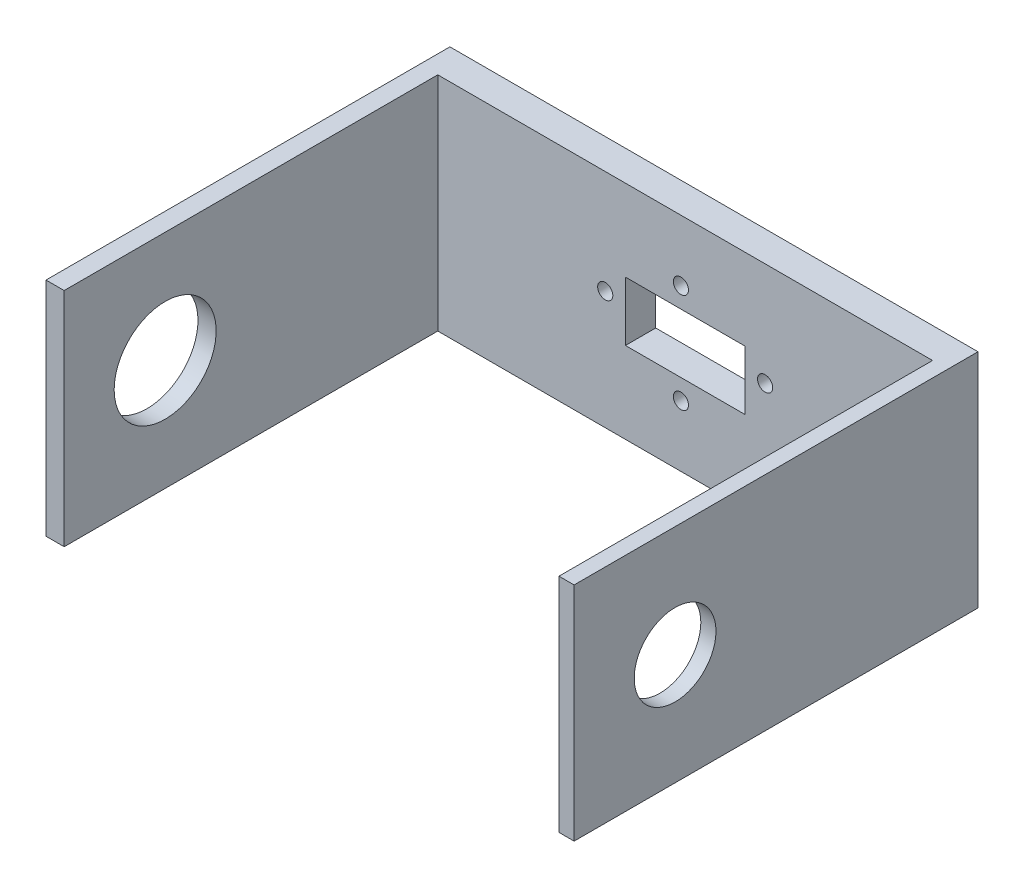
ISO-10303-21;
HEADER;
FILE_DESCRIPTION(('STEP AP214'),'2;1');
FILE_NAME('part.step','',(''),(''),'','','');
FILE_SCHEMA(('AUTOMOTIVE_DESIGN { 1 0 10303 214 1 1 1 1 }'));
ENDSEC;
DATA;
#1=APPLICATION_CONTEXT('core data for automotive mechanical design processes');
#2=APPLICATION_PROTOCOL_DEFINITION('international standard','automotive_design',2000,#1);
#3=PRODUCT_CONTEXT('',#1,'mechanical');
#4=PRODUCT('Part','Part','',(#3));
#5=PRODUCT_RELATED_PRODUCT_CATEGORY('part','',(#4));
#6=PRODUCT_DEFINITION_FORMATION('','',#4);
#7=PRODUCT_DEFINITION_CONTEXT('part definition',#1,'design');
#8=PRODUCT_DEFINITION('design','',#6,#7);
#9=PRODUCT_DEFINITION_SHAPE('','',#8);
#10=(LENGTH_UNIT() NAMED_UNIT(*) SI_UNIT(.MILLI.,.METRE.));
#11=(NAMED_UNIT(*) PLANE_ANGLE_UNIT() SI_UNIT($,.RADIAN.));
#12=(NAMED_UNIT(*) SI_UNIT($,.STERADIAN.) SOLID_ANGLE_UNIT());
#13=UNCERTAINTY_MEASURE_WITH_UNIT(LENGTH_MEASURE(1.E-05),#10,'distance_accuracy_value','');
#14=(GEOMETRIC_REPRESENTATION_CONTEXT(3) GLOBAL_UNCERTAINTY_ASSIGNED_CONTEXT((#13)) GLOBAL_UNIT_ASSIGNED_CONTEXT((#10,
#11,#12)) REPRESENTATION_CONTEXT('',''));
#15=CARTESIAN_POINT('',(0.,0.,0.));
#16=DIRECTION('',(0.,0.,1.));
#17=DIRECTION('',(1.,0.,0.));
#18=AXIS2_PLACEMENT_3D('',#15,#16,#17);
#19=CARTESIAN_POINT('',(0.,0.,3.));
#20=DIRECTION('',(0.,0.,-1.));
#21=DIRECTION('',(-1.,0.,0.));
#22=AXIS2_PLACEMENT_3D('',#19,#20,#21);
#23=PLANE('',#22);
#24=DIRECTION('',(0.,1.,0.));
#25=VECTOR('',#24,1.);
#26=CARTESIAN_POINT('',(24.5,-10.9882336679256,3.));
#27=LINE('',#26,#25);
#28=CARTESIAN_POINT('',(24.5,-10.9882336720744,3.));
#29=VERTEX_POINT('',#28);
#30=CARTESIAN_POINT('',(24.5,10.9882336679256,3.));
#31=VERTEX_POINT('',#30);
#32=EDGE_CURVE('E276',#29,#31,#27,.T.);
#33=ORIENTED_EDGE('',*,*,#32,.T.);
#34=DIRECTION('',(-1.,0.,0.));
#35=VECTOR('',#34,1.);
#36=CARTESIAN_POINT('',(-24.5,10.9882336679256,3.));
#37=LINE('',#36,#35);
#38=CARTESIAN_POINT('',(-24.5,10.9882336679256,3.));
#39=VERTEX_POINT('',#38);
#40=EDGE_CURVE('E280',#31,#39,#37,.T.);
#41=ORIENTED_EDGE('',*,*,#40,.T.);
#42=DIRECTION('',(0.,-1.,0.));
#43=VECTOR('',#42,1.);
#44=CARTESIAN_POINT('',(-24.5,-10.9882336679256,3.));
#45=LINE('',#44,#43);
#46=CARTESIAN_POINT('',(-24.5,-10.9882336679256,3.));
#47=VERTEX_POINT('',#46);
#48=EDGE_CURVE('E49',#39,#47,#45,.T.);
#49=ORIENTED_EDGE('',*,*,#48,.T.);
#50=DIRECTION('',(1.,0.,0.));
#51=VECTOR('',#50,1.);
#52=CARTESIAN_POINT('',(-24.5,-10.9882336679256,3.));
#53=LINE('',#52,#51);
#54=EDGE_CURVE('E11',#47,#29,#53,.T.);
#55=ORIENTED_EDGE('',*,*,#54,.T.);
#56=EDGE_LOOP('',(#33,#41,#49,#55));
#57=FACE_BOUND('',#56,.T.);
#58=DIRECTION('',(0.,1.,0.));
#59=VECTOR('',#58,1.);
#60=CARTESIAN_POINT('',(5.91604588219118,-2.93281751688852,3.));
#61=LINE('',#60,#59);
#62=CARTESIAN_POINT('',(5.91604588219118,-2.93281751688852,3.));
#63=VERTEX_POINT('',#62);
#64=CARTESIAN_POINT('',(5.91604588219118,2.93281751688852,3.));
#65=VERTEX_POINT('',#64);
#66=EDGE_CURVE('E238',#63,#65,#61,.T.);
#67=ORIENTED_EDGE('',*,*,#66,.F.);
#68=DIRECTION('',(1.,0.,0.));
#69=VECTOR('',#68,1.);
#70=CARTESIAN_POINT('',(-5.91604588219121,-2.93281751688852,3.));
#71=LINE('',#70,#69);
#72=CARTESIAN_POINT('',(-5.91604588219121,-2.93281751688852,3.));
#73=VERTEX_POINT('',#72);
#74=EDGE_CURVE('E248',#73,#63,#71,.T.);
#75=ORIENTED_EDGE('',*,*,#74,.F.);
#76=DIRECTION('',(0.,-1.,0.));
#77=VECTOR('',#76,1.);
#78=CARTESIAN_POINT('',(-5.91604588219121,-2.93281751688852,3.));
#79=LINE('',#78,#77);
#80=CARTESIAN_POINT('',(-5.91604588219121,2.93281751688851,3.));
#81=VERTEX_POINT('',#80);
#82=EDGE_CURVE('E245',#81,#73,#79,.T.);
#83=ORIENTED_EDGE('',*,*,#82,.F.);
#84=DIRECTION('',(-1.,0.,0.));
#85=VECTOR('',#84,1.);
#86=CARTESIAN_POINT('',(-5.91604588219121,2.93281751688851,3.));
#87=LINE('',#86,#85);
#88=EDGE_CURVE('E241',#65,#81,#87,.T.);
#89=ORIENTED_EDGE('',*,*,#88,.F.);
#90=EDGE_LOOP('',(#67,#75,#83,#89));
#91=FACE_BOUND('',#90,.T.);
#92=CARTESIAN_POINT('',(-0.421929048228402,4.93281751688851,3.));
#93=DIRECTION('',(0.,0.,1.));
#94=DIRECTION('',(1.,0.,0.));
#95=AXIS2_PLACEMENT_3D('',#92,#93,#94);
#96=CIRCLE('',#95,0.750862633974916);
#97=CARTESIAN_POINT('',(0.328933585746514,4.93281751688851,3.));
#98=VERTEX_POINT('',#97);
#99=EDGE_CURVE('E231',#98,#98,#96,.T.);
#100=ORIENTED_EDGE('',*,*,#99,.F.);
#101=EDGE_LOOP('',(#100));
#102=FACE_BOUND('',#101,.T.);
#103=CARTESIAN_POINT('',(7.91604588219118,0.729927039086684,3.));
#104=DIRECTION('',(0.,0.,1.));
#105=DIRECTION('',(1.,0.,0.));
#106=AXIS2_PLACEMENT_3D('',#103,#104,#105);
#107=CIRCLE('',#106,0.750862633974916);
#108=CARTESIAN_POINT('',(8.6669085161661,0.729927039086684,3.));
#109=VERTEX_POINT('',#108);
#110=EDGE_CURVE('E223',#109,#109,#107,.T.);
#111=ORIENTED_EDGE('',*,*,#110,.F.);
#112=EDGE_LOOP('',(#111));
#113=FACE_BOUND('',#112,.T.);
#114=CARTESIAN_POINT('',(-0.421929048228401,-4.93281751688852,3.));
#115=DIRECTION('',(0.,0.,1.));
#116=DIRECTION('',(-1.,0.,0.));
#117=AXIS2_PLACEMENT_3D('',#114,#115,#116);
#118=CIRCLE('',#117,0.750862633974916);
#119=CARTESIAN_POINT('',(-1.17279168220332,-4.93281751688852,3.));
#120=VERTEX_POINT('',#119);
#121=EDGE_CURVE('E215',#120,#120,#118,.T.);
#122=ORIENTED_EDGE('',*,*,#121,.F.);
#123=EDGE_LOOP('',(#122));
#124=FACE_BOUND('',#123,.T.);
#125=CARTESIAN_POINT('',(-7.91604588219121,0.729927039086682,3.));
#126=DIRECTION('',(0.,0.,1.));
#127=DIRECTION('',(-1.,0.,0.));
#128=AXIS2_PLACEMENT_3D('',#125,#126,#127);
#129=CIRCLE('',#128,0.750862633974916);
#130=CARTESIAN_POINT('',(-8.66690851616612,0.729927039086682,3.));
#131=VERTEX_POINT('',#130);
#132=EDGE_CURVE('E207',#131,#131,#129,.T.);
#133=ORIENTED_EDGE('',*,*,#132,.F.);
#134=EDGE_LOOP('',(#133));
#135=FACE_BOUND('',#134,.T.);
#136=ADVANCED_FACE('F39',(#57,#91,#102,#113,#124,#135),#23,.F.);
#137=CARTESIAN_POINT('',(0.,0.,0.));
#138=DIRECTION('',(0.,0.,-1.));
#139=DIRECTION('',(-1.,0.,0.));
#140=AXIS2_PLACEMENT_3D('',#137,#138,#139);
#141=PLANE('',#140);
#142=CARTESIAN_POINT('',(-0.421929048228401,-4.93281751688852,0.));
#143=DIRECTION('',(0.,0.,1.));
#144=DIRECTION('',(-1.,0.,0.));
#145=AXIS2_PLACEMENT_3D('',#142,#143,#144);
#146=CIRCLE('',#145,0.750862633974916);
#147=CARTESIAN_POINT('',(-1.17279168220332,-4.93281751688852,0.));
#148=VERTEX_POINT('',#147);
#149=EDGE_CURVE('E211',#148,#148,#146,.T.);
#150=ORIENTED_EDGE('',*,*,#149,.T.);
#151=EDGE_LOOP('',(#150));
#152=FACE_BOUND('',#151,.T.);
#153=CARTESIAN_POINT('',(-0.421929048228402,4.93281751688851,0.));
#154=DIRECTION('',(0.,0.,1.));
#155=DIRECTION('',(1.,0.,0.));
#156=AXIS2_PLACEMENT_3D('',#153,#154,#155);
#157=CIRCLE('',#156,0.750862633974916);
#158=CARTESIAN_POINT('',(0.328933585746514,4.93281751688851,0.));
#159=VERTEX_POINT('',#158);
#160=EDGE_CURVE('E227',#159,#159,#157,.T.);
#161=ORIENTED_EDGE('',*,*,#160,.T.);
#162=EDGE_LOOP('',(#161));
#163=FACE_BOUND('',#162,.T.);
#164=DIRECTION('',(-1.,0.,0.));
#165=VECTOR('',#164,1.);
#166=CARTESIAN_POINT('',(-24.5,10.9882336679256,0.));
#167=LINE('',#166,#165);
#168=CARTESIAN_POINT('',(26.,10.9882336679256,0.));
#169=VERTEX_POINT('',#168);
#170=CARTESIAN_POINT('',(-26.3,10.9882336679256,0.));
#171=VERTEX_POINT('',#170);
#172=EDGE_CURVE('E275',#169,#171,#167,.T.);
#173=ORIENTED_EDGE('',*,*,#172,.F.);
#174=DIRECTION('',(0.,1.,0.));
#175=VECTOR('',#174,1.);
#176=CARTESIAN_POINT('',(26.,10.9882336679256,0.));
#177=LINE('',#176,#175);
#178=CARTESIAN_POINT('',(26.,-10.9882336720744,0.));
#179=VERTEX_POINT('',#178);
#180=EDGE_CURVE('E152',#179,#169,#177,.T.);
#181=ORIENTED_EDGE('',*,*,#180,.F.);
#182=DIRECTION('',(1.,0.,0.));
#183=VECTOR('',#182,1.);
#184=CARTESIAN_POINT('',(-24.5,-10.9882336679256,0.));
#185=LINE('',#184,#183);
#186=CARTESIAN_POINT('',(-26.3,-10.9882336679256,0.));
#187=VERTEX_POINT('',#186);
#188=EDGE_CURVE('E43',#187,#179,#185,.T.);
#189=ORIENTED_EDGE('',*,*,#188,.F.);
#190=DIRECTION('',(0.,-1.,0.));
#191=VECTOR('',#190,1.);
#192=CARTESIAN_POINT('',(-26.3,10.9882336679256,0.));
#193=LINE('',#192,#191);
#194=EDGE_CURVE('E179',#171,#187,#193,.T.);
#195=ORIENTED_EDGE('',*,*,#194,.F.);
#196=EDGE_LOOP('',(#173,#181,#189,#195));
#197=FACE_BOUND('',#196,.T.);
#198=DIRECTION('',(1.,0.,0.));
#199=VECTOR('',#198,1.);
#200=CARTESIAN_POINT('',(-5.91604588219121,-2.93281751688852,0.));
#201=LINE('',#200,#199);
#202=CARTESIAN_POINT('',(-5.91604588219121,-2.93281751688852,0.));
#203=VERTEX_POINT('',#202);
#204=CARTESIAN_POINT('',(5.91604588219118,-2.93281751688852,0.));
#205=VERTEX_POINT('',#204);
#206=EDGE_CURVE('E242',#203,#205,#201,.T.);
#207=ORIENTED_EDGE('',*,*,#206,.T.);
#208=DIRECTION('',(0.,1.,0.));
#209=VECTOR('',#208,1.);
#210=CARTESIAN_POINT('',(5.91604588219118,-2.93281751688852,0.));
#211=LINE('',#210,#209);
#212=CARTESIAN_POINT('',(5.91604588219118,2.93281751688852,0.));
#213=VERTEX_POINT('',#212);
#214=EDGE_CURVE('E65',#205,#213,#211,.T.);
#215=ORIENTED_EDGE('',*,*,#214,.T.);
#216=DIRECTION('',(-1.,0.,0.));
#217=VECTOR('',#216,1.);
#218=CARTESIAN_POINT('',(-5.91604588219121,2.93281751688851,0.));
#219=LINE('',#218,#217);
#220=CARTESIAN_POINT('',(-5.91604588219121,2.93281751688851,0.));
#221=VERTEX_POINT('',#220);
#222=EDGE_CURVE('E254',#213,#221,#219,.T.);
#223=ORIENTED_EDGE('',*,*,#222,.T.);
#224=DIRECTION('',(0.,-1.,0.));
#225=VECTOR('',#224,1.);
#226=CARTESIAN_POINT('',(-5.91604588219121,-2.93281751688852,0.));
#227=LINE('',#226,#225);
#228=EDGE_CURVE('E258',#221,#203,#227,.T.);
#229=ORIENTED_EDGE('',*,*,#228,.T.);
#230=EDGE_LOOP('',(#207,#215,#223,#229));
#231=FACE_BOUND('',#230,.T.);
#232=CARTESIAN_POINT('',(7.91604588219118,0.729927039086684,0.));
#233=DIRECTION('',(0.,0.,1.));
#234=DIRECTION('',(1.,0.,0.));
#235=AXIS2_PLACEMENT_3D('',#232,#233,#234);
#236=CIRCLE('',#235,0.750862633974916);
#237=CARTESIAN_POINT('',(8.6669085161661,0.729927039086684,0.));
#238=VERTEX_POINT('',#237);
#239=EDGE_CURVE('E219',#238,#238,#236,.T.);
#240=ORIENTED_EDGE('',*,*,#239,.T.);
#241=EDGE_LOOP('',(#240));
#242=FACE_BOUND('',#241,.T.);
#243=CARTESIAN_POINT('',(-7.91604588219121,0.729927039086682,0.));
#244=DIRECTION('',(0.,0.,1.));
#245=DIRECTION('',(-1.,0.,0.));
#246=AXIS2_PLACEMENT_3D('',#243,#244,#245);
#247=CIRCLE('',#246,0.750862633974916);
#248=CARTESIAN_POINT('',(-8.66690851616612,0.729927039086682,0.));
#249=VERTEX_POINT('',#248);
#250=EDGE_CURVE('E206',#249,#249,#247,.T.);
#251=ORIENTED_EDGE('',*,*,#250,.T.);
#252=EDGE_LOOP('',(#251));
#253=FACE_BOUND('',#252,.T.);
#254=ADVANCED_FACE('F297',(#152,#163,#197,#231,#242,#253),#141,.T.);
#255=CARTESIAN_POINT('',(-24.5,10.9882336679256,3.));
#256=DIRECTION('',(0.,-1.,0.));
#257=DIRECTION('',(1.,0.,0.));
#258=AXIS2_PLACEMENT_3D('',#255,#256,#257);
#259=PLANE('',#258);
#260=ORIENTED_EDGE('',*,*,#172,.T.);
#261=DIRECTION('',(0.,0.,-1.));
#262=VECTOR('',#261,1.);
#263=CARTESIAN_POINT('',(-26.3,10.9882336679256,0.));
#264=LINE('',#263,#262);
#265=CARTESIAN_POINT('',(-26.3,10.9882336679256,40.));
#266=VERTEX_POINT('',#265);
#267=EDGE_CURVE('E175',#266,#171,#264,.T.);
#268=ORIENTED_EDGE('',*,*,#267,.F.);
#269=DIRECTION('',(1.,0.,0.));
#270=VECTOR('',#269,1.);
#271=CARTESIAN_POINT('',(-26.3,10.9882336679256,40.));
#272=LINE('',#271,#270);
#273=CARTESIAN_POINT('',(-24.5,10.9882336679256,40.));
#274=VERTEX_POINT('',#273);
#275=EDGE_CURVE('E190',#266,#274,#272,.T.);
#276=ORIENTED_EDGE('',*,*,#275,.T.);
#277=DIRECTION('',(0.,0.,-1.));
#278=VECTOR('',#277,1.);
#279=CARTESIAN_POINT('',(-24.5,10.9882336679256,0.));
#280=LINE('',#279,#278);
#281=EDGE_CURVE('E173',#274,#39,#280,.T.);
#282=ORIENTED_EDGE('',*,*,#281,.T.);
#283=ORIENTED_EDGE('',*,*,#40,.F.);
#284=DIRECTION('',(0.,0.,1.));
#285=VECTOR('',#284,1.);
#286=CARTESIAN_POINT('',(24.5,10.9882336679256,0.));
#287=LINE('',#286,#285);
#288=CARTESIAN_POINT('',(24.5,10.9882336679256,40.));
#289=VERTEX_POINT('',#288);
#290=EDGE_CURVE('E158',#31,#289,#287,.T.);
#291=ORIENTED_EDGE('',*,*,#290,.T.);
#292=DIRECTION('',(-1.,0.,0.));
#293=VECTOR('',#292,1.);
#294=CARTESIAN_POINT('',(26.,10.9882336679256,40.));
#295=LINE('',#294,#293);
#296=CARTESIAN_POINT('',(26.,10.9882336679256,40.));
#297=VERTEX_POINT('',#296);
#298=EDGE_CURVE('E137',#297,#289,#295,.T.);
#299=ORIENTED_EDGE('',*,*,#298,.F.);
#300=DIRECTION('',(0.,0.,1.));
#301=VECTOR('',#300,1.);
#302=CARTESIAN_POINT('',(26.,10.9882336679256,0.));
#303=LINE('',#302,#301);
#304=EDGE_CURVE('E145',#169,#297,#303,.T.);
#305=ORIENTED_EDGE('',*,*,#304,.F.);
#306=EDGE_LOOP('',(#260,#268,#276,#282,#283,#291,#299,#305));
#307=FACE_BOUND('',#306,.T.);
#308=ADVANCED_FACE('F41',(#307),#259,.F.);
#309=CARTESIAN_POINT('',(-24.5,-10.9882336679256,3.));
#310=DIRECTION('',(0.,1.,0.));
#311=DIRECTION('',(0.,0.,1.));
#312=AXIS2_PLACEMENT_3D('',#309,#310,#311);
#313=PLANE('',#312);
#314=ORIENTED_EDGE('',*,*,#188,.T.);
#315=DIRECTION('',(0.,0.,-1.));
#316=VECTOR('',#315,1.);
#317=CARTESIAN_POINT('',(26.,-10.9882336720744,0.));
#318=LINE('',#317,#316);
#319=CARTESIAN_POINT('',(26.,-10.9882336720744,40.));
#320=VERTEX_POINT('',#319);
#321=EDGE_CURVE('E144',#320,#179,#318,.T.);
#322=ORIENTED_EDGE('',*,*,#321,.F.);
#323=DIRECTION('',(-1.,0.,0.));
#324=VECTOR('',#323,1.);
#325=CARTESIAN_POINT('',(26.,-10.9882336720744,40.));
#326=LINE('',#325,#324);
#327=CARTESIAN_POINT('',(24.5,-10.9882336720744,40.));
#328=VERTEX_POINT('',#327);
#329=EDGE_CURVE('E139',#320,#328,#326,.T.);
#330=ORIENTED_EDGE('',*,*,#329,.T.);
#331=DIRECTION('',(0.,0.,-1.));
#332=VECTOR('',#331,1.);
#333=CARTESIAN_POINT('',(24.5,-10.9882336720744,0.));
#334=LINE('',#333,#332);
#335=EDGE_CURVE('E155',#328,#29,#334,.T.);
#336=ORIENTED_EDGE('',*,*,#335,.T.);
#337=ORIENTED_EDGE('',*,*,#54,.F.);
#338=DIRECTION('',(0.,0.,1.));
#339=VECTOR('',#338,1.);
#340=CARTESIAN_POINT('',(-24.5,-10.9882336679256,0.));
#341=LINE('',#340,#339);
#342=CARTESIAN_POINT('',(-24.5,-10.9882336679256,40.));
#343=VERTEX_POINT('',#342);
#344=EDGE_CURVE('E194',#47,#343,#341,.T.);
#345=ORIENTED_EDGE('',*,*,#344,.T.);
#346=DIRECTION('',(1.,0.,0.));
#347=VECTOR('',#346,1.);
#348=CARTESIAN_POINT('',(-26.3,-10.9882336679256,40.));
#349=LINE('',#348,#347);
#350=CARTESIAN_POINT('',(-26.3,-10.9882336679256,40.));
#351=VERTEX_POINT('',#350);
#352=EDGE_CURVE('E202',#351,#343,#349,.T.);
#353=ORIENTED_EDGE('',*,*,#352,.F.);
#354=DIRECTION('',(0.,0.,1.));
#355=VECTOR('',#354,1.);
#356=CARTESIAN_POINT('',(-26.3,-10.9882336679256,0.));
#357=LINE('',#356,#355);
#358=EDGE_CURVE('E184',#187,#351,#357,.T.);
#359=ORIENTED_EDGE('',*,*,#358,.F.);
#360=EDGE_LOOP('',(#314,#322,#330,#336,#337,#345,#353,#359));
#361=FACE_BOUND('',#360,.T.);
#362=ADVANCED_FACE('F292',(#361),#313,.F.);
#363=CARTESIAN_POINT('',(5.91604588219118,-2.93281751688852,3.));
#364=DIRECTION('',(-1.,0.,0.));
#365=DIRECTION('',(0.,-1.,0.));
#366=AXIS2_PLACEMENT_3D('',#363,#364,#365);
#367=PLANE('',#366);
#368=ORIENTED_EDGE('',*,*,#214,.F.);
#369=DIRECTION('',(0.,0.,-1.));
#370=VECTOR('',#369,1.);
#371=CARTESIAN_POINT('',(5.91604588219118,-2.93281751688852,3.));
#372=LINE('',#371,#370);
#373=EDGE_CURVE('E251',#63,#205,#372,.T.);
#374=ORIENTED_EDGE('',*,*,#373,.F.);
#375=ORIENTED_EDGE('',*,*,#66,.T.);
#376=DIRECTION('',(0.,0.,-1.));
#377=VECTOR('',#376,1.);
#378=CARTESIAN_POINT('',(5.91604588219118,2.93281751688852,3.));
#379=LINE('',#378,#377);
#380=EDGE_CURVE('E272',#65,#213,#379,.T.);
#381=ORIENTED_EDGE('',*,*,#380,.T.);
#382=EDGE_LOOP('',(#368,#374,#375,#381));
#383=FACE_BOUND('',#382,.T.);
#384=ADVANCED_FACE('F353',(#383),#367,.T.);
#385=CARTESIAN_POINT('',(-5.91604588219121,2.93281751688851,3.));
#386=DIRECTION('',(0.,-1.,0.));
#387=DIRECTION('',(1.,0.,0.));
#388=AXIS2_PLACEMENT_3D('',#385,#386,#387);
#389=PLANE('',#388);
#390=ORIENTED_EDGE('',*,*,#222,.F.);
#391=ORIENTED_EDGE('',*,*,#380,.F.);
#392=ORIENTED_EDGE('',*,*,#88,.T.);
#393=DIRECTION('',(0.,0.,-1.));
#394=VECTOR('',#393,1.);
#395=CARTESIAN_POINT('',(-5.91604588219121,2.93281751688851,3.));
#396=LINE('',#395,#394);
#397=EDGE_CURVE('E269',#81,#221,#396,.T.);
#398=ORIENTED_EDGE('',*,*,#397,.T.);
#399=EDGE_LOOP('',(#390,#391,#392,#398));
#400=FACE_BOUND('',#399,.T.);
#401=ADVANCED_FACE('F360',(#400),#389,.T.);
#402=CARTESIAN_POINT('',(-5.91604588219121,-2.93281751688852,3.));
#403=DIRECTION('',(1.,0.,0.));
#404=DIRECTION('',(0.,1.,0.));
#405=AXIS2_PLACEMENT_3D('',#402,#403,#404);
#406=PLANE('',#405);
#407=ORIENTED_EDGE('',*,*,#228,.F.);
#408=ORIENTED_EDGE('',*,*,#397,.F.);
#409=ORIENTED_EDGE('',*,*,#82,.T.);
#410=DIRECTION('',(0.,0.,-1.));
#411=VECTOR('',#410,1.);
#412=CARTESIAN_POINT('',(-5.91604588219121,-2.93281751688852,3.));
#413=LINE('',#412,#411);
#414=EDGE_CURVE('E57',#73,#203,#413,.T.);
#415=ORIENTED_EDGE('',*,*,#414,.T.);
#416=EDGE_LOOP('',(#407,#408,#409,#415));
#417=FACE_BOUND('',#416,.T.);
#418=ADVANCED_FACE('F443',(#417),#406,.T.);
#419=CARTESIAN_POINT('',(-5.91604588219121,-2.93281751688852,3.));
#420=DIRECTION('',(0.,1.,0.));
#421=DIRECTION('',(-1.,0.,0.));
#422=AXIS2_PLACEMENT_3D('',#419,#420,#421);
#423=PLANE('',#422);
#424=ORIENTED_EDGE('',*,*,#206,.F.);
#425=ORIENTED_EDGE('',*,*,#414,.F.);
#426=ORIENTED_EDGE('',*,*,#74,.T.);
#427=ORIENTED_EDGE('',*,*,#373,.T.);
#428=EDGE_LOOP('',(#424,#425,#426,#427));
#429=FACE_BOUND('',#428,.T.);
#430=ADVANCED_FACE('F433',(#429),#423,.T.);
#431=CARTESIAN_POINT('',(-0.421929048228402,4.93281751688851,3.));
#432=DIRECTION('',(0.,0.,-1.));
#433=DIRECTION('',(-1.,0.,0.));
#434=AXIS2_PLACEMENT_3D('',#431,#432,#433);
#435=CYLINDRICAL_SURFACE('',#434,0.750862633974916);
#436=ORIENTED_EDGE('',*,*,#99,.T.);
#437=EDGE_LOOP('',(#436));
#438=FACE_BOUND('',#437,.T.);
#439=ORIENTED_EDGE('',*,*,#160,.F.);
#440=EDGE_LOOP('',(#439));
#441=FACE_BOUND('',#440,.T.);
#442=ADVANCED_FACE('F423',(#438,#441),#435,.F.);
#443=CARTESIAN_POINT('',(7.91604588219118,0.729927039086684,3.));
#444=DIRECTION('',(0.,0.,-1.));
#445=DIRECTION('',(-1.,0.,0.));
#446=AXIS2_PLACEMENT_3D('',#443,#444,#445);
#447=CYLINDRICAL_SURFACE('',#446,0.750862633974916);
#448=ORIENTED_EDGE('',*,*,#110,.T.);
#449=EDGE_LOOP('',(#448));
#450=FACE_BOUND('',#449,.T.);
#451=ORIENTED_EDGE('',*,*,#239,.F.);
#452=EDGE_LOOP('',(#451));
#453=FACE_BOUND('',#452,.T.);
#454=ADVANCED_FACE('F413',(#450,#453),#447,.F.);
#455=CARTESIAN_POINT('',(-0.421929048228401,-4.93281751688852,3.));
#456=DIRECTION('',(0.,0.,-1.));
#457=DIRECTION('',(-1.,0.,0.));
#458=AXIS2_PLACEMENT_3D('',#455,#456,#457);
#459=CYLINDRICAL_SURFACE('',#458,0.750862633974916);
#460=ORIENTED_EDGE('',*,*,#121,.T.);
#461=EDGE_LOOP('',(#460));
#462=FACE_BOUND('',#461,.T.);
#463=ORIENTED_EDGE('',*,*,#149,.F.);
#464=EDGE_LOOP('',(#463));
#465=FACE_BOUND('',#464,.T.);
#466=ADVANCED_FACE('F341',(#462,#465),#459,.F.);
#467=CARTESIAN_POINT('',(-7.91604588219121,0.729927039086682,3.));
#468=DIRECTION('',(0.,0.,-1.));
#469=DIRECTION('',(-1.,0.,0.));
#470=AXIS2_PLACEMENT_3D('',#467,#468,#469);
#471=CYLINDRICAL_SURFACE('',#470,0.750862633974916);
#472=ORIENTED_EDGE('',*,*,#132,.T.);
#473=EDGE_LOOP('',(#472));
#474=FACE_BOUND('',#473,.T.);
#475=ORIENTED_EDGE('',*,*,#250,.F.);
#476=EDGE_LOOP('',(#475));
#477=FACE_BOUND('',#476,.T.);
#478=ADVANCED_FACE('F336',(#474,#477),#471,.F.);
#479=CARTESIAN_POINT('',(-24.5,0.,0.));
#480=DIRECTION('',(1.,0.,0.));
#481=DIRECTION('',(0.,0.,-1.));
#482=AXIS2_PLACEMENT_3D('',#479,#480,#481);
#483=PLANE('',#482);
#484=CARTESIAN_POINT('',(-24.5,0.,30.));
#485=DIRECTION('',(-1.,0.,0.));
#486=DIRECTION('',(0.,0.,1.));
#487=AXIS2_PLACEMENT_3D('',#484,#485,#486);
#488=CIRCLE('',#487,5.05);
#489=CARTESIAN_POINT('',(-24.5,0.,35.05));
#490=VERTEX_POINT('',#489);
#491=EDGE_CURVE('E161',#490,#490,#488,.T.);
#492=ORIENTED_EDGE('',*,*,#491,.T.);
#493=EDGE_LOOP('',(#492));
#494=FACE_BOUND('',#493,.T.);
#495=ORIENTED_EDGE('',*,*,#48,.F.);
#496=ORIENTED_EDGE('',*,*,#281,.F.);
#497=DIRECTION('',(0.,1.,0.));
#498=VECTOR('',#497,1.);
#499=CARTESIAN_POINT('',(-24.5,10.9882336679256,40.));
#500=LINE('',#499,#498);
#501=EDGE_CURVE('E180',#343,#274,#500,.T.);
#502=ORIENTED_EDGE('',*,*,#501,.F.);
#503=ORIENTED_EDGE('',*,*,#344,.F.);
#504=EDGE_LOOP('',(#495,#496,#502,#503));
#505=FACE_BOUND('',#504,.T.);
#506=ADVANCED_FACE('F316',(#494,#505),#483,.T.);
#507=CARTESIAN_POINT('',(-26.3,0.,0.));
#508=DIRECTION('',(1.,0.,0.));
#509=DIRECTION('',(0.,0.,-1.));
#510=AXIS2_PLACEMENT_3D('',#507,#508,#509);
#511=PLANE('',#510);
#512=ORIENTED_EDGE('',*,*,#267,.T.);
#513=ORIENTED_EDGE('',*,*,#194,.T.);
#514=ORIENTED_EDGE('',*,*,#358,.T.);
#515=DIRECTION('',(0.,1.,0.));
#516=VECTOR('',#515,1.);
#517=CARTESIAN_POINT('',(-26.3,10.9882336679256,40.));
#518=LINE('',#517,#516);
#519=EDGE_CURVE('E187',#351,#266,#518,.T.);
#520=ORIENTED_EDGE('',*,*,#519,.T.);
#521=EDGE_LOOP('',(#512,#513,#514,#520));
#522=FACE_BOUND('',#521,.T.);
#523=CARTESIAN_POINT('',(-26.3,0.,30.));
#524=DIRECTION('',(-1.,0.,0.));
#525=DIRECTION('',(0.,0.,1.));
#526=AXIS2_PLACEMENT_3D('',#523,#524,#525);
#527=CIRCLE('',#526,5.05);
#528=CARTESIAN_POINT('',(-26.3,0.,35.05));
#529=VERTEX_POINT('',#528);
#530=EDGE_CURVE('E166',#529,#529,#527,.T.);
#531=ORIENTED_EDGE('',*,*,#530,.F.);
#532=EDGE_LOOP('',(#531));
#533=FACE_BOUND('',#532,.T.);
#534=ADVANCED_FACE('F323',(#522,#533),#511,.F.);
#535=CARTESIAN_POINT('',(-26.3,10.9882336679256,40.));
#536=DIRECTION('',(0.,0.,-1.));
#537=DIRECTION('',(-1.,0.,0.));
#538=AXIS2_PLACEMENT_3D('',#535,#536,#537);
#539=PLANE('',#538);
#540=ORIENTED_EDGE('',*,*,#501,.T.);
#541=ORIENTED_EDGE('',*,*,#275,.F.);
#542=ORIENTED_EDGE('',*,*,#519,.F.);
#543=ORIENTED_EDGE('',*,*,#352,.T.);
#544=EDGE_LOOP('',(#540,#541,#542,#543));
#545=FACE_BOUND('',#544,.T.);
#546=ADVANCED_FACE('F321',(#545),#539,.F.);
#547=CARTESIAN_POINT('',(-26.3,0.,30.));
#548=DIRECTION('',(1.,0.,0.));
#549=DIRECTION('',(0.,0.,-1.));
#550=AXIS2_PLACEMENT_3D('',#547,#548,#549);
#551=CYLINDRICAL_SURFACE('',#550,5.05);
#552=ORIENTED_EDGE('',*,*,#530,.T.);
#553=EDGE_LOOP('',(#552));
#554=FACE_BOUND('',#553,.T.);
#555=ORIENTED_EDGE('',*,*,#491,.F.);
#556=EDGE_LOOP('',(#555));
#557=FACE_BOUND('',#556,.T.);
#558=ADVANCED_FACE('F329',(#554,#557),#551,.F.);
#559=CARTESIAN_POINT('',(26.,0.,0.));
#560=DIRECTION('',(1.,0.,0.));
#561=DIRECTION('',(0.,0.,-1.));
#562=AXIS2_PLACEMENT_3D('',#559,#560,#561);
#563=PLANE('',#562);
#564=ORIENTED_EDGE('',*,*,#304,.T.);
#565=DIRECTION('',(0.,-1.,0.));
#566=VECTOR('',#565,1.);
#567=CARTESIAN_POINT('',(26.,10.9882336679256,40.));
#568=LINE('',#567,#566);
#569=EDGE_CURVE('E133',#297,#320,#568,.T.);
#570=ORIENTED_EDGE('',*,*,#569,.T.);
#571=ORIENTED_EDGE('',*,*,#321,.T.);
#572=ORIENTED_EDGE('',*,*,#180,.T.);
#573=EDGE_LOOP('',(#564,#570,#571,#572));
#574=FACE_BOUND('',#573,.T.);
#575=CARTESIAN_POINT('',(26.,0.,30.));
#576=DIRECTION('',(1.,0.,0.));
#577=DIRECTION('',(0.,0.,-1.));
#578=AXIS2_PLACEMENT_3D('',#575,#576,#577);
#579=CIRCLE('',#578,4.05);
#580=CARTESIAN_POINT('',(26.,0.,25.95));
#581=VERTEX_POINT('',#580);
#582=EDGE_CURVE('E305',#581,#581,#579,.T.);
#583=ORIENTED_EDGE('',*,*,#582,.F.);
#584=EDGE_LOOP('',(#583));
#585=FACE_BOUND('',#584,.T.);
#586=ADVANCED_FACE('F149',(#574,#585),#563,.T.);
#587=CARTESIAN_POINT('',(24.5,0.,0.));
#588=DIRECTION('',(1.,0.,0.));
#589=DIRECTION('',(0.,0.,-1.));
#590=AXIS2_PLACEMENT_3D('',#587,#588,#589);
#591=PLANE('',#590);
#592=ORIENTED_EDGE('',*,*,#32,.F.);
#593=ORIENTED_EDGE('',*,*,#335,.F.);
#594=DIRECTION('',(0.,-1.,0.));
#595=VECTOR('',#594,1.);
#596=CARTESIAN_POINT('',(24.5,10.9882336679256,40.));
#597=LINE('',#596,#595);
#598=EDGE_CURVE('E304',#289,#328,#597,.T.);
#599=ORIENTED_EDGE('',*,*,#598,.F.);
#600=ORIENTED_EDGE('',*,*,#290,.F.);
#601=EDGE_LOOP('',(#592,#593,#599,#600));
#602=FACE_BOUND('',#601,.T.);
#603=CARTESIAN_POINT('',(24.5,0.,30.));
#604=DIRECTION('',(1.,0.,0.));
#605=DIRECTION('',(0.,0.,-1.));
#606=AXIS2_PLACEMENT_3D('',#603,#604,#605);
#607=CIRCLE('',#606,4.05);
#608=CARTESIAN_POINT('',(24.5,0.,25.95));
#609=VERTEX_POINT('',#608);
#610=EDGE_CURVE('E530',#609,#609,#607,.T.);
#611=ORIENTED_EDGE('',*,*,#610,.T.);
#612=EDGE_LOOP('',(#611));
#613=FACE_BOUND('',#612,.T.);
#614=ADVANCED_FACE('F496',(#602,#613),#591,.F.);
#615=CARTESIAN_POINT('',(26.,10.9882336679256,40.));
#616=DIRECTION('',(0.,0.,-1.));
#617=DIRECTION('',(0.,1.,0.));
#618=AXIS2_PLACEMENT_3D('',#615,#616,#617);
#619=PLANE('',#618);
#620=ORIENTED_EDGE('',*,*,#598,.T.);
#621=ORIENTED_EDGE('',*,*,#329,.F.);
#622=ORIENTED_EDGE('',*,*,#569,.F.);
#623=ORIENTED_EDGE('',*,*,#298,.T.);
#624=EDGE_LOOP('',(#620,#621,#622,#623));
#625=FACE_BOUND('',#624,.T.);
#626=ADVANCED_FACE('F135',(#625),#619,.F.);
#627=CARTESIAN_POINT('',(26.,0.,30.));
#628=DIRECTION('',(-1.,0.,0.));
#629=DIRECTION('',(0.,0.,1.));
#630=AXIS2_PLACEMENT_3D('',#627,#628,#629);
#631=CYLINDRICAL_SURFACE('',#630,4.05);
#632=ORIENTED_EDGE('',*,*,#582,.T.);
#633=EDGE_LOOP('',(#632));
#634=FACE_BOUND('',#633,.T.);
#635=ORIENTED_EDGE('',*,*,#610,.F.);
#636=EDGE_LOOP('',(#635));
#637=FACE_BOUND('',#636,.T.);
#638=ADVANCED_FACE('F511',(#634,#637),#631,.F.);
#639=CLOSED_SHELL('',(#136,#254,#308,#362,#384,#401,#418,#430,#442,#454,#466,#478,#506,#534,
#546,#558,#586,#614,#626,#638));
#640=MANIFOLD_SOLID_BREP('B2',#639);
#641=ADVANCED_BREP_SHAPE_REPRESENTATION('',(#18,#640),#14);
#642=SHAPE_DEFINITION_REPRESENTATION(#9,#641);
ENDSEC;
END-ISO-10303-21;
